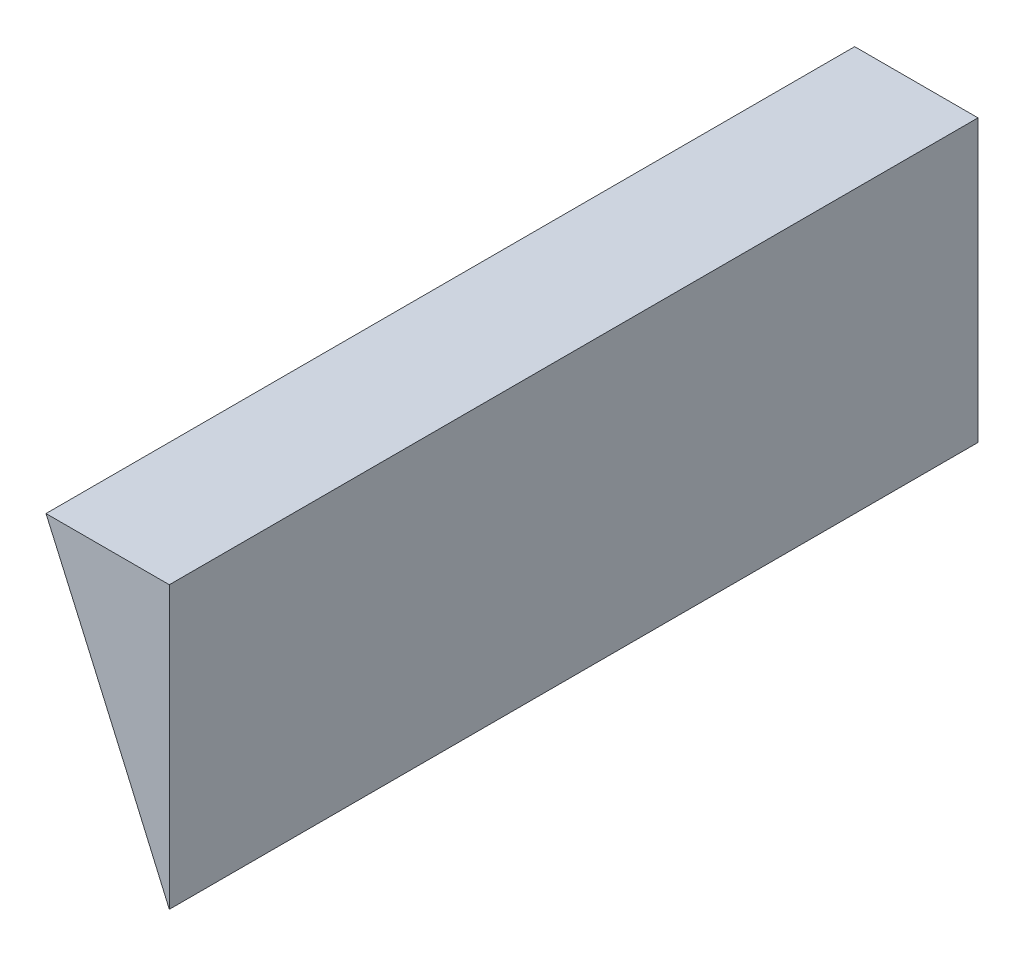
ISO-10303-21;
HEADER;
FILE_DESCRIPTION(('STEP AP214'),'2;1');
FILE_NAME('part.step','',(''),(''),'','','');
FILE_SCHEMA(('AUTOMOTIVE_DESIGN { 1 0 10303 214 1 1 1 1 }'));
ENDSEC;
DATA;
#1=APPLICATION_CONTEXT('core data for automotive mechanical design processes');
#2=APPLICATION_PROTOCOL_DEFINITION('international standard','automotive_design',2000,#1);
#3=PRODUCT_CONTEXT('',#1,'mechanical');
#4=PRODUCT('Part','Part','',(#3));
#5=PRODUCT_RELATED_PRODUCT_CATEGORY('part','',(#4));
#6=PRODUCT_DEFINITION_FORMATION('','',#4);
#7=PRODUCT_DEFINITION_CONTEXT('part definition',#1,'design');
#8=PRODUCT_DEFINITION('design','',#6,#7);
#9=PRODUCT_DEFINITION_SHAPE('','',#8);
#10=(LENGTH_UNIT() NAMED_UNIT(*) SI_UNIT(.MILLI.,.METRE.));
#11=(NAMED_UNIT(*) PLANE_ANGLE_UNIT() SI_UNIT($,.RADIAN.));
#12=(NAMED_UNIT(*) SI_UNIT($,.STERADIAN.) SOLID_ANGLE_UNIT());
#13=UNCERTAINTY_MEASURE_WITH_UNIT(LENGTH_MEASURE(1.E-05),#10,'distance_accuracy_value','');
#14=(GEOMETRIC_REPRESENTATION_CONTEXT(3) GLOBAL_UNCERTAINTY_ASSIGNED_CONTEXT((#13)) GLOBAL_UNIT_ASSIGNED_CONTEXT((#10,
#11,#12)) REPRESENTATION_CONTEXT('',''));
#15=CARTESIAN_POINT('',(0.,0.,0.));
#16=DIRECTION('',(0.,0.,1.));
#17=DIRECTION('',(1.,0.,0.));
#18=AXIS2_PLACEMENT_3D('',#15,#16,#17);
#19=CARTESIAN_POINT('',(65.182892379,-0.8408173686334,-10.675));
#20=DIRECTION('',(0.,0.,1.));
#21=DIRECTION('',(1.,0.,0.));
#22=AXIS2_PLACEMENT_3D('',#19,#20,#21);
#23=CYLINDRICAL_SURFACE('',#22,27.21153739474);
#24=CARTESIAN_POINT('',(65.182892379,-0.8408173686334,0.73));
#25=DIRECTION('',(0.,0.,1.));
#26=DIRECTION('',(0.917519185441732,0.397691519077714,0.));
#27=AXIS2_PLACEMENT_3D('',#24,#25,#26);
#28=CIRCLE('',#27,27.21153739474);
#29=CARTESIAN_POINT('',(90.15000000404,9.980980274318,0.73));
#30=VERTEX_POINT('',#29);
#31=CARTESIAN_POINT('',(90.05392209655,10.20000000029,0.73));
#32=VERTEX_POINT('',#31);
#33=EDGE_CURVE('E11',#30,#32,#28,.T.);
#34=ORIENTED_EDGE('',*,*,#33,.T.);
#35=DIRECTION('',(0.,0.,1.));
#36=VECTOR('',#35,1.);
#37=CARTESIAN_POINT('',(90.05392209655,10.20000000029,0.1));
#38=LINE('',#37,#36);
#39=CARTESIAN_POINT('',(90.05392209655,10.20000000029,0.1));
#40=VERTEX_POINT('',#39);
#41=EDGE_CURVE('E41',#40,#32,#38,.T.);
#42=ORIENTED_EDGE('',*,*,#41,.F.);
#43=CARTESIAN_POINT('',(65.182892379,-0.8408173686334,0.1));
#44=DIRECTION('',(0.,0.,-1.));
#45=DIRECTION('',(0.913988407077686,0.405740300842294,0.));
#46=AXIS2_PLACEMENT_3D('',#43,#44,#45);
#47=CIRCLE('',#46,27.21153739474);
#48=CARTESIAN_POINT('',(90.15000000404,9.980980274319,0.1));
#49=VERTEX_POINT('',#48);
#50=EDGE_CURVE('E27',#40,#49,#47,.T.);
#51=ORIENTED_EDGE('',*,*,#50,.T.);
#52=DIRECTION('',(-8.571626653614E-13,1.84684719017E-12,-1.));
#53=VECTOR('',#52,1.);
#54=CARTESIAN_POINT('',(90.15000000404,9.980980274318,0.73));
#55=LINE('',#54,#53);
#56=EDGE_CURVE('E69',#30,#49,#55,.T.);
#57=ORIENTED_EDGE('',*,*,#56,.F.);
#58=EDGE_LOOP('',(#34,#42,#51,#57));
#59=FACE_BOUND('',#58,.T.);
#60=ADVANCED_FACE('F17',(#59),#23,.F.);
#61=CARTESIAN_POINT('',(88.65000000174,8.700000002809,0.73));
#62=DIRECTION('',(0.,0.,1.));
#63=DIRECTION('',(1.,0.,0.));
#64=AXIS2_PLACEMENT_3D('',#61,#62,#63);
#65=PLANE('',#64);
#66=ORIENTED_EDGE('',*,*,#33,.F.);
#67=DIRECTION('',(-1.78988735713E-09,-1.,0.));
#68=VECTOR('',#67,1.);
#69=CARTESIAN_POINT('',(90.15000000443,10.20000000012,0.73));
#70=LINE('',#69,#68);
#71=CARTESIAN_POINT('',(90.15000000443,10.20000000012,0.73));
#72=VERTEX_POINT('',#71);
#73=EDGE_CURVE('E62',#72,#30,#70,.T.);
#74=ORIENTED_EDGE('',*,*,#73,.F.);
#75=DIRECTION('',(-1.,1.790465430389E-09,0.));
#76=VECTOR('',#75,1.);
#77=CARTESIAN_POINT('',(90.15000000443,10.20000000012,0.73));
#78=LINE('',#77,#76);
#79=EDGE_CURVE('E64',#72,#32,#78,.T.);
#80=ORIENTED_EDGE('',*,*,#79,.T.);
#81=EDGE_LOOP('',(#66,#74,#80));
#82=FACE_BOUND('',#81,.T.);
#83=ADVANCED_FACE('F63',(#82),#65,.T.);
#84=CARTESIAN_POINT('',(90.15000000443,10.20000000012,0.1));
#85=DIRECTION('',(-1.794896736965E-09,-1.,0.));
#86=DIRECTION('',(-1.,1.794896736965E-09,0.));
#87=AXIS2_PLACEMENT_3D('',#84,#85,#86);
#88=PLANE('',#87);
#89=DIRECTION('',(-1.,1.790465430399E-09,0.));
#90=VECTOR('',#89,1.);
#91=CARTESIAN_POINT('',(90.15000000443,10.20000000012,0.1));
#92=LINE('',#91,#90);
#93=CARTESIAN_POINT('',(90.15000000443,10.20000000012,0.1));
#94=VERTEX_POINT('',#93);
#95=EDGE_CURVE('E73',#94,#40,#92,.T.);
#96=ORIENTED_EDGE('',*,*,#95,.T.);
#97=ORIENTED_EDGE('',*,*,#41,.T.);
#98=ORIENTED_EDGE('',*,*,#79,.F.);
#99=DIRECTION('',(7.66935016376E-13,0.,1.));
#100=VECTOR('',#99,1.);
#101=CARTESIAN_POINT('',(90.15000000443,10.20000000012,0.1));
#102=LINE('',#101,#100);
#103=EDGE_CURVE('E20',#94,#72,#102,.T.);
#104=ORIENTED_EDGE('',*,*,#103,.F.);
#105=EDGE_LOOP('',(#96,#97,#98,#104));
#106=FACE_BOUND('',#105,.T.);
#107=ADVANCED_FACE('F70',(#106),#88,.F.);
#108=CARTESIAN_POINT('',(90.14999999905,7.200000000117,0.1));
#109=DIRECTION('',(-1.,1.794896736965E-09,0.));
#110=DIRECTION('',(0.,0.,1.));
#111=AXIS2_PLACEMENT_3D('',#108,#109,#110);
#112=PLANE('',#111);
#113=ORIENTED_EDGE('',*,*,#73,.T.);
#114=ORIENTED_EDGE('',*,*,#56,.T.);
#115=DIRECTION('',(1.789887357139E-09,1.,0.));
#116=VECTOR('',#115,1.);
#117=CARTESIAN_POINT('',(90.15000000404,9.980980274319,0.1));
#118=LINE('',#117,#116);
#119=EDGE_CURVE('E78',#49,#94,#118,.T.);
#120=ORIENTED_EDGE('',*,*,#119,.T.);
#121=ORIENTED_EDGE('',*,*,#103,.T.);
#122=EDGE_LOOP('',(#113,#114,#120,#121));
#123=FACE_BOUND('',#122,.T.);
#124=ADVANCED_FACE('F76',(#123),#112,.F.);
#125=CARTESIAN_POINT('',(88.65000000174,8.700000002809,0.1));
#126=DIRECTION('',(0.,0.,1.));
#127=DIRECTION('',(1.,0.,0.));
#128=AXIS2_PLACEMENT_3D('',#125,#126,#127);
#129=PLANE('',#128);
#130=ORIENTED_EDGE('',*,*,#50,.F.);
#131=ORIENTED_EDGE('',*,*,#95,.F.);
#132=ORIENTED_EDGE('',*,*,#119,.F.);
#133=EDGE_LOOP('',(#130,#131,#132));
#134=FACE_BOUND('',#133,.T.);
#135=ADVANCED_FACE('F128',(#134),#129,.F.);
#136=CLOSED_SHELL('',(#60,#83,#107,#124,#135));
#137=MANIFOLD_SOLID_BREP('B1',#136);
#138=ADVANCED_BREP_SHAPE_REPRESENTATION('',(#18,#137),#14);
#139=SHAPE_DEFINITION_REPRESENTATION(#9,#138);
ENDSEC;
END-ISO-10303-21;
